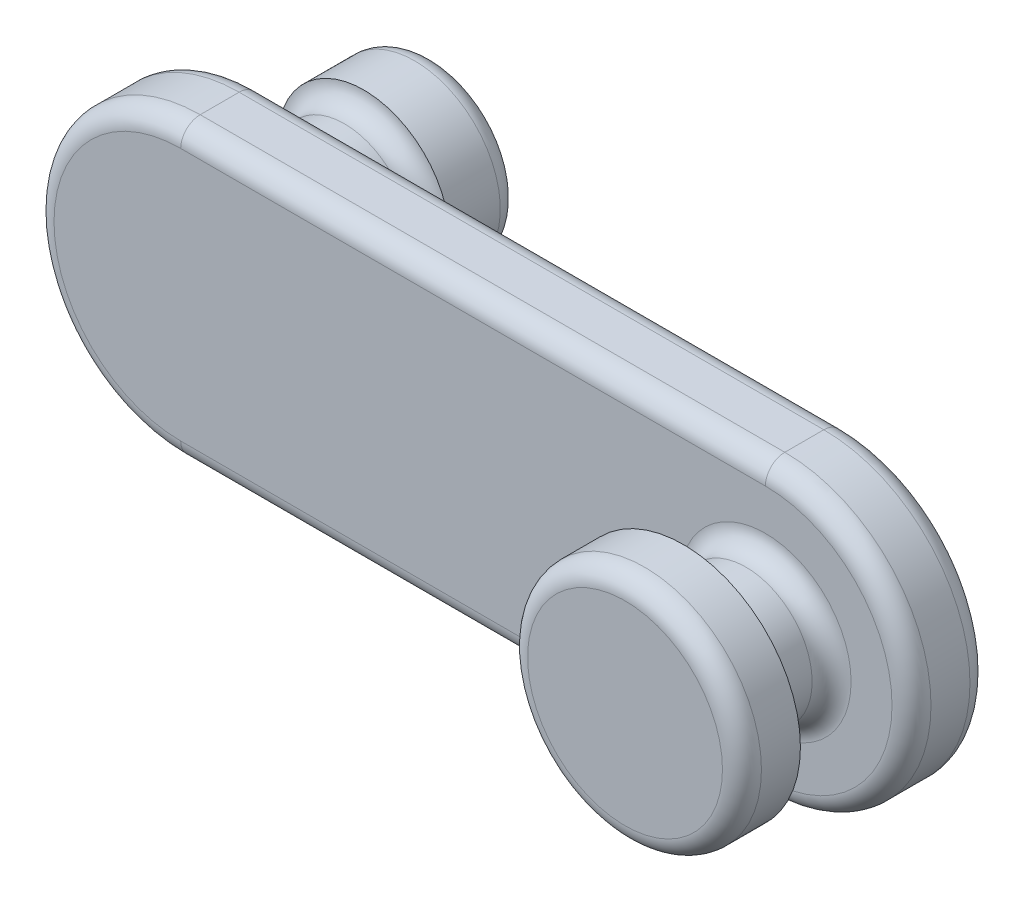
ISO-10303-21;
HEADER;
FILE_DESCRIPTION(('STEP AP214'),'2;1');
FILE_NAME('part.step','',(''),(''),'','','');
FILE_SCHEMA(('AUTOMOTIVE_DESIGN { 1 0 10303 214 1 1 1 1 }'));
ENDSEC;
DATA;
#1=APPLICATION_CONTEXT('core data for automotive mechanical design processes');
#2=APPLICATION_PROTOCOL_DEFINITION('international standard','automotive_design',2000,#1);
#3=PRODUCT_CONTEXT('',#1,'mechanical');
#4=PRODUCT('Part','Part','',(#3));
#5=PRODUCT_RELATED_PRODUCT_CATEGORY('part','',(#4));
#6=PRODUCT_DEFINITION_FORMATION('','',#4);
#7=PRODUCT_DEFINITION_CONTEXT('part definition',#1,'design');
#8=PRODUCT_DEFINITION('design','',#6,#7);
#9=PRODUCT_DEFINITION_SHAPE('','',#8);
#10=(LENGTH_UNIT() NAMED_UNIT(*) SI_UNIT(.MILLI.,.METRE.));
#11=(NAMED_UNIT(*) PLANE_ANGLE_UNIT() SI_UNIT($,.RADIAN.));
#12=(NAMED_UNIT(*) SI_UNIT($,.STERADIAN.) SOLID_ANGLE_UNIT());
#13=UNCERTAINTY_MEASURE_WITH_UNIT(LENGTH_MEASURE(1.E-05),#10,'distance_accuracy_value','');
#14=(GEOMETRIC_REPRESENTATION_CONTEXT(3) GLOBAL_UNCERTAINTY_ASSIGNED_CONTEXT((#13)) GLOBAL_UNIT_ASSIGNED_CONTEXT((#10,
#11,#12)) REPRESENTATION_CONTEXT('',''));
#15=CARTESIAN_POINT('',(0.,0.,0.));
#16=DIRECTION('',(0.,0.,1.));
#17=DIRECTION('',(1.,0.,0.));
#18=AXIS2_PLACEMENT_3D('',#15,#16,#17);
#19=CARTESIAN_POINT('',(-15.,0.,4.));
#20=DIRECTION('',(0.,0.,1.));
#21=DIRECTION('',(1.,0.,0.));
#22=AXIS2_PLACEMENT_3D('',#19,#20,#21);
#23=PLANE('',#22);
#24=CARTESIAN_POINT('',(15.,0.,4.));
#25=DIRECTION('',(0.,0.,1.));
#26=DIRECTION('',(1.,0.,0.));
#27=AXIS2_PLACEMENT_3D('',#24,#25,#26);
#28=CIRCLE('',#27,4.4);
#29=CARTESIAN_POINT('',(19.4,0.,4.));
#30=VERTEX_POINT('',#29);
#31=EDGE_CURVE('E126',#30,#30,#28,.F.);
#32=ORIENTED_EDGE('',*,*,#31,.T.);
#33=EDGE_LOOP('',(#32));
#34=FACE_BOUND('',#33,.T.);
#35=DIRECTION('',(1.,0.,0.));
#36=VECTOR('',#35,1.);
#37=CARTESIAN_POINT('',(15.,-6.5,4.));
#38=LINE('',#37,#36);
#39=CARTESIAN_POINT('',(-15.,-6.5,4.));
#40=VERTEX_POINT('',#39);
#41=CARTESIAN_POINT('',(15.,-6.5,4.));
#42=VERTEX_POINT('',#41);
#43=EDGE_CURVE('E124',#40,#42,#38,.T.);
#44=ORIENTED_EDGE('',*,*,#43,.T.);
#45=CARTESIAN_POINT('',(15.,0.,4.));
#46=DIRECTION('',(0.,0.,1.));
#47=DIRECTION('',(1.,0.,0.));
#48=AXIS2_PLACEMENT_3D('',#45,#46,#47);
#49=CIRCLE('',#48,6.5);
#50=CARTESIAN_POINT('',(15.,6.5,4.));
#51=VERTEX_POINT('',#50);
#52=EDGE_CURVE('E106',#42,#51,#49,.T.);
#53=ORIENTED_EDGE('',*,*,#52,.T.);
#54=DIRECTION('',(-1.,0.,0.));
#55=VECTOR('',#54,1.);
#56=CARTESIAN_POINT('',(-15.,6.5,4.));
#57=LINE('',#56,#55);
#58=CARTESIAN_POINT('',(-15.,6.5,4.));
#59=VERTEX_POINT('',#58);
#60=EDGE_CURVE('E114',#51,#59,#57,.T.);
#61=ORIENTED_EDGE('',*,*,#60,.T.);
#62=CARTESIAN_POINT('',(-15.,0.,4.));
#63=DIRECTION('',(0.,0.,1.));
#64=DIRECTION('',(1.,0.,0.));
#65=AXIS2_PLACEMENT_3D('',#62,#63,#64);
#66=CIRCLE('',#65,6.5);
#67=EDGE_CURVE('E120',#59,#40,#66,.T.);
#68=ORIENTED_EDGE('',*,*,#67,.T.);
#69=EDGE_LOOP('',(#44,#53,#61,#68));
#70=FACE_BOUND('',#69,.T.);
#71=ADVANCED_FACE('F32',(#34,#70),#23,.T.);
#72=CARTESIAN_POINT('',(-15.,0.,0.));
#73=DIRECTION('',(0.,0.,1.));
#74=DIRECTION('',(1.,0.,0.));
#75=AXIS2_PLACEMENT_3D('',#72,#73,#74);
#76=PLANE('',#75);
#77=DIRECTION('',(-1.,0.,0.));
#78=VECTOR('',#77,1.);
#79=CARTESIAN_POINT('',(-15.,6.5,0.));
#80=LINE('',#79,#78);
#81=CARTESIAN_POINT('',(-15.,6.5,0.));
#82=VERTEX_POINT('',#81);
#83=CARTESIAN_POINT('',(15.,6.5,0.));
#84=VERTEX_POINT('',#83);
#85=EDGE_CURVE('E148',#82,#84,#80,.F.);
#86=ORIENTED_EDGE('',*,*,#85,.T.);
#87=CARTESIAN_POINT('',(15.,0.,0.));
#88=DIRECTION('',(0.,0.,1.));
#89=DIRECTION('',(1.,0.,0.));
#90=AXIS2_PLACEMENT_3D('',#87,#88,#89);
#91=CIRCLE('',#90,6.5);
#92=CARTESIAN_POINT('',(15.,-6.5,0.));
#93=VERTEX_POINT('',#92);
#94=EDGE_CURVE('E153',#84,#93,#91,.F.);
#95=ORIENTED_EDGE('',*,*,#94,.T.);
#96=DIRECTION('',(1.,0.,0.));
#97=VECTOR('',#96,1.);
#98=CARTESIAN_POINT('',(-15.,-6.5,0.));
#99=LINE('',#98,#97);
#100=CARTESIAN_POINT('',(-15.,-6.5,0.));
#101=VERTEX_POINT('',#100);
#102=EDGE_CURVE('E56',#93,#101,#99,.F.);
#103=ORIENTED_EDGE('',*,*,#102,.T.);
#104=CARTESIAN_POINT('',(-15.,0.,0.));
#105=DIRECTION('',(0.,0.,1.));
#106=DIRECTION('',(1.,0.,0.));
#107=AXIS2_PLACEMENT_3D('',#104,#105,#106);
#108=CIRCLE('',#107,6.5);
#109=EDGE_CURVE('E150',#101,#82,#108,.F.);
#110=ORIENTED_EDGE('',*,*,#109,.T.);
#111=EDGE_LOOP('',(#86,#95,#103,#110));
#112=FACE_BOUND('',#111,.T.);
#113=CARTESIAN_POINT('',(-15.,0.,0.));
#114=DIRECTION('',(0.,0.,1.));
#115=DIRECTION('',(1.,0.,0.));
#116=AXIS2_PLACEMENT_3D('',#113,#114,#115);
#117=CIRCLE('',#116,4.4);
#118=CARTESIAN_POINT('',(-10.6,0.,0.));
#119=VERTEX_POINT('',#118);
#120=EDGE_CURVE('E145',#119,#119,#117,.T.);
#121=ORIENTED_EDGE('',*,*,#120,.T.);
#122=EDGE_LOOP('',(#121));
#123=FACE_BOUND('',#122,.T.);
#124=ADVANCED_FACE('F204',(#112,#123),#76,.F.);
#125=CARTESIAN_POINT('',(-15.,0.,4.));
#126=DIRECTION('',(0.,0.,-1.));
#127=DIRECTION('',(-1.,0.,0.));
#128=AXIS2_PLACEMENT_3D('',#125,#126,#127);
#129=CYLINDRICAL_SURFACE('',#128,7.5);
#130=DIRECTION('',(0.,0.,-1.));
#131=VECTOR('',#130,1.);
#132=CARTESIAN_POINT('',(-15.,-7.5,4.));
#133=LINE('',#132,#131);
#134=CARTESIAN_POINT('',(-15.,-7.5,3.));
#135=VERTEX_POINT('',#134);
#136=CARTESIAN_POINT('',(-15.,-7.5,1.));
#137=VERTEX_POINT('',#136);
#138=EDGE_CURVE('E121',#135,#137,#133,.T.);
#139=ORIENTED_EDGE('',*,*,#138,.F.);
#140=CARTESIAN_POINT('',(-15.,0.,3.));
#141=DIRECTION('',(0.,0.,1.));
#142=DIRECTION('',(1.,0.,0.));
#143=AXIS2_PLACEMENT_3D('',#140,#141,#142);
#144=CIRCLE('',#143,7.5);
#145=CARTESIAN_POINT('',(-15.,7.5,3.));
#146=VERTEX_POINT('',#145);
#147=EDGE_CURVE('E143',#135,#146,#144,.F.);
#148=ORIENTED_EDGE('',*,*,#147,.T.);
#149=DIRECTION('',(0.,0.,-1.));
#150=VECTOR('',#149,1.);
#151=CARTESIAN_POINT('',(-15.,7.5,4.));
#152=LINE('',#151,#150);
#153=CARTESIAN_POINT('',(-15.,7.5,1.));
#154=VERTEX_POINT('',#153);
#155=EDGE_CURVE('E221',#146,#154,#152,.T.);
#156=ORIENTED_EDGE('',*,*,#155,.T.);
#157=CARTESIAN_POINT('',(-15.,0.,1.));
#158=DIRECTION('',(0.,0.,1.));
#159=DIRECTION('',(1.,0.,0.));
#160=AXIS2_PLACEMENT_3D('',#157,#158,#159);
#161=CIRCLE('',#160,7.5);
#162=EDGE_CURVE('E141',#154,#137,#161,.T.);
#163=ORIENTED_EDGE('',*,*,#162,.T.);
#164=EDGE_LOOP('',(#139,#148,#156,#163));
#165=FACE_BOUND('',#164,.T.);
#166=ADVANCED_FACE('F240',(#165),#129,.T.);
#167=CARTESIAN_POINT('',(-15.,-7.5,4.));
#168=DIRECTION('',(0.,1.,0.));
#169=DIRECTION('',(0.,0.,1.));
#170=AXIS2_PLACEMENT_3D('',#167,#168,#169);
#171=PLANE('',#170);
#172=DIRECTION('',(0.,0.,-1.));
#173=VECTOR('',#172,1.);
#174=CARTESIAN_POINT('',(15.,-7.5,4.));
#175=LINE('',#174,#173);
#176=CARTESIAN_POINT('',(15.,-7.5,3.));
#177=VERTEX_POINT('',#176);
#178=CARTESIAN_POINT('',(15.,-7.5,1.));
#179=VERTEX_POINT('',#178);
#180=EDGE_CURVE('E219',#177,#179,#175,.T.);
#181=ORIENTED_EDGE('',*,*,#180,.F.);
#182=DIRECTION('',(1.,0.,0.));
#183=VECTOR('',#182,1.);
#184=CARTESIAN_POINT('',(-15.,-7.5,3.));
#185=LINE('',#184,#183);
#186=EDGE_CURVE('E139',#177,#135,#185,.F.);
#187=ORIENTED_EDGE('',*,*,#186,.T.);
#188=ORIENTED_EDGE('',*,*,#138,.T.);
#189=DIRECTION('',(1.,0.,0.));
#190=VECTOR('',#189,1.);
#191=CARTESIAN_POINT('',(-15.,-7.5,1.));
#192=LINE('',#191,#190);
#193=EDGE_CURVE('E137',#137,#179,#192,.T.);
#194=ORIENTED_EDGE('',*,*,#193,.T.);
#195=EDGE_LOOP('',(#181,#187,#188,#194));
#196=FACE_BOUND('',#195,.T.);
#197=ADVANCED_FACE('F238',(#196),#171,.F.);
#198=CARTESIAN_POINT('',(15.,0.,4.));
#199=DIRECTION('',(0.,0.,-1.));
#200=DIRECTION('',(-1.,0.,0.));
#201=AXIS2_PLACEMENT_3D('',#198,#199,#200);
#202=CYLINDRICAL_SURFACE('',#201,7.5);
#203=DIRECTION('',(0.,0.,-1.));
#204=VECTOR('',#203,1.);
#205=CARTESIAN_POINT('',(15.,7.5,4.));
#206=LINE('',#205,#204);
#207=CARTESIAN_POINT('',(15.,7.5,3.));
#208=VERTEX_POINT('',#207);
#209=CARTESIAN_POINT('',(15.,7.5,1.));
#210=VERTEX_POINT('',#209);
#211=EDGE_CURVE('E217',#208,#210,#206,.T.);
#212=ORIENTED_EDGE('',*,*,#211,.F.);
#213=CARTESIAN_POINT('',(15.,0.,3.));
#214=DIRECTION('',(0.,0.,1.));
#215=DIRECTION('',(1.,0.,0.));
#216=AXIS2_PLACEMENT_3D('',#213,#214,#215);
#217=CIRCLE('',#216,7.5);
#218=EDGE_CURVE('E108',#208,#177,#217,.F.);
#219=ORIENTED_EDGE('',*,*,#218,.T.);
#220=ORIENTED_EDGE('',*,*,#180,.T.);
#221=CARTESIAN_POINT('',(15.,0.,1.));
#222=DIRECTION('',(0.,0.,1.));
#223=DIRECTION('',(1.,0.,0.));
#224=AXIS2_PLACEMENT_3D('',#221,#222,#223);
#225=CIRCLE('',#224,7.5);
#226=EDGE_CURVE('E129',#179,#210,#225,.T.);
#227=ORIENTED_EDGE('',*,*,#226,.T.);
#228=EDGE_LOOP('',(#212,#219,#220,#227));
#229=FACE_BOUND('',#228,.T.);
#230=ADVANCED_FACE('F216',(#229),#202,.T.);
#231=CARTESIAN_POINT('',(-15.,7.5,4.));
#232=DIRECTION('',(0.,-1.,0.));
#233=DIRECTION('',(0.,0.,-1.));
#234=AXIS2_PLACEMENT_3D('',#231,#232,#233);
#235=PLANE('',#234);
#236=ORIENTED_EDGE('',*,*,#155,.F.);
#237=DIRECTION('',(-1.,0.,0.));
#238=VECTOR('',#237,1.);
#239=CARTESIAN_POINT('',(15.,7.5,3.));
#240=LINE('',#239,#238);
#241=EDGE_CURVE('E175',#146,#208,#240,.F.);
#242=ORIENTED_EDGE('',*,*,#241,.T.);
#243=ORIENTED_EDGE('',*,*,#211,.T.);
#244=DIRECTION('',(-1.,0.,0.));
#245=VECTOR('',#244,1.);
#246=CARTESIAN_POINT('',(-15.,7.5,1.));
#247=LINE('',#246,#245);
#248=EDGE_CURVE('E173',#210,#154,#247,.T.);
#249=ORIENTED_EDGE('',*,*,#248,.T.);
#250=EDGE_LOOP('',(#236,#242,#243,#249));
#251=FACE_BOUND('',#250,.T.);
#252=ADVANCED_FACE('F220',(#251),#235,.F.);
#253=CARTESIAN_POINT('',(-15.,0.,-5.4));
#254=DIRECTION('',(0.,0.,1.));
#255=DIRECTION('',(1.,0.,0.));
#256=AXIS2_PLACEMENT_3D('',#253,#254,#255);
#257=CYLINDRICAL_SURFACE('',#256,3.4);
#258=CARTESIAN_POINT('',(-15.,0.,-1.));
#259=DIRECTION('',(0.,0.,1.));
#260=DIRECTION('',(1.,0.,0.));
#261=AXIS2_PLACEMENT_3D('',#258,#259,#260);
#262=CIRCLE('',#261,3.4);
#263=CARTESIAN_POINT('',(-11.6,0.,-1.));
#264=VERTEX_POINT('',#263);
#265=EDGE_CURVE('E41',#264,#264,#262,.F.);
#266=CARTESIAN_POINT('',(-15.,0.,-4.4));
#267=DIRECTION('',(0.,0.,-1.));
#268=DIRECTION('',(-1.,0.,0.));
#269=AXIS2_PLACEMENT_3D('',#266,#267,#268);
#270=CIRCLE('',#269,3.4);
#271=CARTESIAN_POINT('',(-11.6,0.,-4.4));
#272=VERTEX_POINT('',#271);
#273=EDGE_CURVE('E177',#272,#272,#270,.F.);
#274=CARTESIAN_POINT('',(-11.6,0.,-1.));
#275=CARTESIAN_POINT('',(-11.6,0.,-1.03541666666667));
#276=CARTESIAN_POINT('',(-11.6,0.,-1.07083333333333));
#277=CARTESIAN_POINT('',(-11.6,0.,-1.14166666666667));
#278=CARTESIAN_POINT('',(-11.6,0.,-1.17708333333333));
#279=CARTESIAN_POINT('',(-11.6,0.,-1.24791666666667));
#280=CARTESIAN_POINT('',(-11.6,0.,-1.28333333333333));
#281=CARTESIAN_POINT('',(-11.6,0.,-1.35416666666667));
#282=CARTESIAN_POINT('',(-11.6,0.,-1.38958333333333));
#283=CARTESIAN_POINT('',(-11.6,0.,-1.46041666666667));
#284=CARTESIAN_POINT('',(-11.6,0.,-1.49583333333333));
#285=CARTESIAN_POINT('',(-11.6,0.,-1.56666666666667));
#286=CARTESIAN_POINT('',(-11.6,0.,-1.60208333333333));
#287=CARTESIAN_POINT('',(-11.6,0.,-1.67291666666667));
#288=CARTESIAN_POINT('',(-11.6,0.,-1.70833333333333));
#289=CARTESIAN_POINT('',(-11.6,0.,-1.77916666666667));
#290=CARTESIAN_POINT('',(-11.6,0.,-1.81458333333333));
#291=CARTESIAN_POINT('',(-11.6,0.,-1.88541666666667));
#292=CARTESIAN_POINT('',(-11.6,0.,-1.92083333333333));
#293=CARTESIAN_POINT('',(-11.6,0.,-1.99166666666667));
#294=CARTESIAN_POINT('',(-11.6,0.,-2.02708333333333));
#295=CARTESIAN_POINT('',(-11.6,0.,-2.09791666666667));
#296=CARTESIAN_POINT('',(-11.6,0.,-2.13333333333333));
#297=CARTESIAN_POINT('',(-11.6,0.,-2.20416666666667));
#298=CARTESIAN_POINT('',(-11.6,0.,-2.23958333333333));
#299=CARTESIAN_POINT('',(-11.6,0.,-2.31041666666667));
#300=CARTESIAN_POINT('',(-11.6,0.,-2.34583333333333));
#301=CARTESIAN_POINT('',(-11.6,0.,-2.41666666666667));
#302=CARTESIAN_POINT('',(-11.6,0.,-2.45208333333333));
#303=CARTESIAN_POINT('',(-11.6,0.,-2.52291666666667));
#304=CARTESIAN_POINT('',(-11.6,0.,-2.55833333333333));
#305=CARTESIAN_POINT('',(-11.6,0.,-2.62916666666667));
#306=CARTESIAN_POINT('',(-11.6,0.,-2.66458333333333));
#307=CARTESIAN_POINT('',(-11.6,0.,-2.73541666666667));
#308=CARTESIAN_POINT('',(-11.6,0.,-2.77083333333333));
#309=CARTESIAN_POINT('',(-11.6,0.,-2.84166666666667));
#310=CARTESIAN_POINT('',(-11.6,0.,-2.87708333333333));
#311=CARTESIAN_POINT('',(-11.6,0.,-2.94791666666667));
#312=CARTESIAN_POINT('',(-11.6,0.,-2.98333333333333));
#313=CARTESIAN_POINT('',(-11.6,0.,-3.05416666666667));
#314=CARTESIAN_POINT('',(-11.6,0.,-3.08958333333333));
#315=CARTESIAN_POINT('',(-11.6,0.,-3.16041666666667));
#316=CARTESIAN_POINT('',(-11.6,0.,-3.19583333333333));
#317=CARTESIAN_POINT('',(-11.6,0.,-3.26666666666667));
#318=CARTESIAN_POINT('',(-11.6,0.,-3.30208333333333));
#319=CARTESIAN_POINT('',(-11.6,0.,-3.37291666666667));
#320=CARTESIAN_POINT('',(-11.6,0.,-3.40833333333333));
#321=CARTESIAN_POINT('',(-11.6,0.,-3.47916666666667));
#322=CARTESIAN_POINT('',(-11.6,0.,-3.51458333333333));
#323=CARTESIAN_POINT('',(-11.6,0.,-3.58541666666667));
#324=CARTESIAN_POINT('',(-11.6,0.,-3.62083333333333));
#325=CARTESIAN_POINT('',(-11.6,0.,-3.69166666666667));
#326=CARTESIAN_POINT('',(-11.6,0.,-3.72708333333333));
#327=CARTESIAN_POINT('',(-11.6,0.,-3.79791666666667));
#328=CARTESIAN_POINT('',(-11.6,0.,-3.83333333333333));
#329=CARTESIAN_POINT('',(-11.6,0.,-3.90416666666667));
#330=CARTESIAN_POINT('',(-11.6,0.,-3.93958333333333));
#331=CARTESIAN_POINT('',(-11.6,0.,-4.01041666666667));
#332=CARTESIAN_POINT('',(-11.6,0.,-4.04583333333333));
#333=CARTESIAN_POINT('',(-11.6,0.,-4.11666666666667));
#334=CARTESIAN_POINT('',(-11.6,0.,-4.15208333333333));
#335=CARTESIAN_POINT('',(-11.6,0.,-4.22291666666667));
#336=CARTESIAN_POINT('',(-11.6,0.,-4.25833333333333));
#337=CARTESIAN_POINT('',(-11.6,0.,-4.32916666666667));
#338=CARTESIAN_POINT('',(-11.6,0.,-4.36458333333333));
#339=CARTESIAN_POINT('',(-11.6,0.,-4.4));
#340=B_SPLINE_CURVE_WITH_KNOTS('',3,(#274,#275,#276,#277,#278,#279,#280,#281,#282,#283,#284,
#285,#286,#287,#288,#289,#290,#291,#292,#293,#294,#295,#296,#297,#298,#299,#300,#301,#302,#303,
#304,#305,#306,#307,#308,#309,#310,#311,#312,#313,#314,#315,#316,#317,#318,#319,#320,#321,#322,
#323,#324,#325,#326,#327,#328,#329,#330,#331,#332,#333,#334,#335,#336,#337,#338,#339),
.UNSPECIFIED.,.F.,.F.,(4,2,2,2,2,2,2,2,2,2,2,2,2,2,2,2,2,2,2,2,2,2,2,2,2,2,2,2,2,2,2,2,4),(0.,
0.10625,0.2125,0.31875,0.425,0.531249999999999,0.6375,0.743749999999999,0.849999999999999,
0.956249999999999,1.0625,1.16875,1.275,1.38125,1.4875,1.59375,1.7,1.80625,1.9125,2.01875,2.125,
2.23125,2.3375,2.44375,2.55,2.65625,2.7625,2.86875,2.975,3.08125,3.1875,3.29375,3.4),.UNSPECIFIED.);
#341=EDGE_CURVE('BSEAM256',#264,#272,#340,.T.);
#342=ORIENTED_EDGE('',*,*,#265,.T.);
#343=ORIENTED_EDGE('',*,*,#273,.T.);
#344=ORIENTED_EDGE('',*,*,#341,.T.);
#345=ORIENTED_EDGE('',*,*,#341,.F.);
#346=EDGE_LOOP('',(#342,#344,#343,#345));
#347=FACE_BOUND('',#346,.T.);
#348=ADVANCED_FACE('F256',(#347),#257,.T.);
#349=CARTESIAN_POINT('',(-15.,0.,-9.));
#350=DIRECTION('',(0.,0.,1.));
#351=DIRECTION('',(1.,0.,0.));
#352=AXIS2_PLACEMENT_3D('',#349,#350,#351);
#353=CYLINDRICAL_SURFACE('',#352,4.4);
#354=CARTESIAN_POINT('',(-15.,0.,-8.));
#355=DIRECTION('',(0.,0.,-1.));
#356=DIRECTION('',(-1.,0.,0.));
#357=AXIS2_PLACEMENT_3D('',#354,#355,#356);
#358=CIRCLE('',#357,4.4);
#359=CARTESIAN_POINT('',(-19.4,0.,-8.));
#360=VERTEX_POINT('',#359);
#361=EDGE_CURVE('E170',#360,#360,#358,.F.);
#362=ORIENTED_EDGE('',*,*,#361,.T.);
#363=EDGE_LOOP('',(#362));
#364=FACE_BOUND('',#363,.T.);
#365=CARTESIAN_POINT('',(-15.,0.,-5.4));
#366=DIRECTION('',(0.,0.,-1.));
#367=DIRECTION('',(-1.,0.,0.));
#368=AXIS2_PLACEMENT_3D('',#365,#366,#367);
#369=CIRCLE('',#368,4.4);
#370=CARTESIAN_POINT('',(-19.4,0.,-5.4));
#371=VERTEX_POINT('',#370);
#372=EDGE_CURVE('E224',#371,#371,#369,.T.);
#373=ORIENTED_EDGE('',*,*,#372,.T.);
#374=EDGE_LOOP('',(#373));
#375=FACE_BOUND('',#374,.T.);
#376=ADVANCED_FACE('F276',(#364,#375),#353,.T.);
#377=CARTESIAN_POINT('',(-15.,0.,-9.));
#378=DIRECTION('',(0.,0.,-1.));
#379=DIRECTION('',(-1.,0.,0.));
#380=AXIS2_PLACEMENT_3D('',#377,#378,#379);
#381=PLANE('',#380);
#382=CARTESIAN_POINT('',(-15.,0.,-9.));
#383=DIRECTION('',(0.,0.,-1.));
#384=DIRECTION('',(-1.,0.,0.));
#385=AXIS2_PLACEMENT_3D('',#382,#383,#384);
#386=CIRCLE('',#385,3.4);
#387=CARTESIAN_POINT('',(-18.4,0.,-9.));
#388=VERTEX_POINT('',#387);
#389=EDGE_CURVE('E167',#388,#388,#386,.T.);
#390=ORIENTED_EDGE('',*,*,#389,.T.);
#391=EDGE_LOOP('',(#390));
#392=FACE_BOUND('',#391,.T.);
#393=ADVANCED_FACE('F283',(#392),#381,.T.);
#394=CARTESIAN_POINT('',(15.,0.,8.2));
#395=DIRECTION('',(0.,0.,-1.));
#396=DIRECTION('',(-1.,0.,0.));
#397=AXIS2_PLACEMENT_3D('',#394,#395,#396);
#398=CYLINDRICAL_SURFACE('',#397,3.4);
#399=CARTESIAN_POINT('',(15.,0.,5.));
#400=DIRECTION('',(0.,0.,1.));
#401=DIRECTION('',(1.,0.,0.));
#402=AXIS2_PLACEMENT_3D('',#399,#400,#401);
#403=CIRCLE('',#402,3.4);
#404=CARTESIAN_POINT('',(18.4,0.,5.));
#405=VERTEX_POINT('',#404);
#406=EDGE_CURVE('E164',#405,#405,#403,.T.);
#407=ORIENTED_EDGE('',*,*,#406,.T.);
#408=EDGE_LOOP('',(#407));
#409=FACE_BOUND('',#408,.T.);
#410=CARTESIAN_POINT('',(15.,0.,7.2));
#411=DIRECTION('',(0.,0.,1.));
#412=DIRECTION('',(1.,0.,0.));
#413=AXIS2_PLACEMENT_3D('',#410,#411,#412);
#414=CIRCLE('',#413,3.4);
#415=CARTESIAN_POINT('',(18.4,0.,7.2));
#416=VERTEX_POINT('',#415);
#417=EDGE_CURVE('E161',#416,#416,#414,.F.);
#418=ORIENTED_EDGE('',*,*,#417,.T.);
#419=EDGE_LOOP('',(#418));
#420=FACE_BOUND('',#419,.T.);
#421=ADVANCED_FACE('F290',(#409,#420),#398,.T.);
#422=CARTESIAN_POINT('',(15.,0.,8.2));
#423=DIRECTION('',(0.,0.,1.));
#424=DIRECTION('',(1.,0.,0.));
#425=AXIS2_PLACEMENT_3D('',#422,#423,#424);
#426=PLANE('',#425);
#427=CARTESIAN_POINT('',(15.,0.,8.2));
#428=DIRECTION('',(0.,0.,1.));
#429=DIRECTION('',(1.,0.,0.));
#430=AXIS2_PLACEMENT_3D('',#427,#428,#429);
#431=CIRCLE('',#430,4.4);
#432=CARTESIAN_POINT('',(19.4,0.,8.2));
#433=VERTEX_POINT('',#432);
#434=EDGE_CURVE('E11',#433,#433,#431,.T.);
#435=ORIENTED_EDGE('',*,*,#434,.T.);
#436=EDGE_LOOP('',(#435));
#437=FACE_BOUND('',#436,.T.);
#438=CARTESIAN_POINT('',(15.,0.,8.2));
#439=DIRECTION('',(0.,0.,1.));
#440=DIRECTION('',(1.,0.,0.));
#441=AXIS2_PLACEMENT_3D('',#438,#439,#440);
#442=CIRCLE('',#441,6.);
#443=CARTESIAN_POINT('',(21.,0.,8.2));
#444=VERTEX_POINT('',#443);
#445=EDGE_CURVE('E187',#444,#444,#442,.T.);
#446=ORIENTED_EDGE('',*,*,#445,.F.);
#447=EDGE_LOOP('',(#446));
#448=FACE_BOUND('',#447,.T.);
#449=ADVANCED_FACE('F298',(#437,#448),#426,.F.);
#450=CARTESIAN_POINT('',(15.,0.,11.2));
#451=DIRECTION('',(0.,0.,-1.));
#452=DIRECTION('',(-1.,0.,0.));
#453=AXIS2_PLACEMENT_3D('',#450,#451,#452);
#454=CYLINDRICAL_SURFACE('',#453,6.);
#455=CARTESIAN_POINT('',(15.,0.,10.2));
#456=DIRECTION('',(0.,0.,1.));
#457=DIRECTION('',(1.,0.,0.));
#458=AXIS2_PLACEMENT_3D('',#455,#456,#457);
#459=CIRCLE('',#458,6.);
#460=CARTESIAN_POINT('',(21.,0.,10.2));
#461=VERTEX_POINT('',#460);
#462=EDGE_CURVE('E158',#461,#461,#459,.F.);
#463=ORIENTED_EDGE('',*,*,#462,.T.);
#464=EDGE_LOOP('',(#463));
#465=FACE_BOUND('',#464,.T.);
#466=ORIENTED_EDGE('',*,*,#445,.T.);
#467=EDGE_LOOP('',(#466));
#468=FACE_BOUND('',#467,.T.);
#469=ADVANCED_FACE('F306',(#465,#468),#454,.T.);
#470=CARTESIAN_POINT('',(15.,0.,11.2));
#471=DIRECTION('',(0.,0.,1.));
#472=DIRECTION('',(1.,0.,0.));
#473=AXIS2_PLACEMENT_3D('',#470,#471,#472);
#474=PLANE('',#473);
#475=CARTESIAN_POINT('',(15.,0.,11.2));
#476=DIRECTION('',(0.,0.,1.));
#477=DIRECTION('',(1.,0.,0.));
#478=AXIS2_PLACEMENT_3D('',#475,#476,#477);
#479=CIRCLE('',#478,5.);
#480=CARTESIAN_POINT('',(20.,0.,11.2));
#481=VERTEX_POINT('',#480);
#482=EDGE_CURVE('E155',#481,#481,#479,.T.);
#483=ORIENTED_EDGE('',*,*,#482,.T.);
#484=EDGE_LOOP('',(#483));
#485=FACE_BOUND('',#484,.T.);
#486=ADVANCED_FACE('F314',(#485),#474,.T.);
#487=CARTESIAN_POINT('',(-15.,0.,3.));
#488=DIRECTION('',(0.,0.,1.));
#489=DIRECTION('',(1.,0.,0.));
#490=AXIS2_PLACEMENT_3D('',#487,#488,#489);
#491=TOROIDAL_SURFACE('',#490,6.5,1.);
#492=CARTESIAN_POINT('',(-15.,6.5,3.));
#493=DIRECTION('',(1.,0.,0.));
#494=DIRECTION('',(0.,0.,-1.));
#495=AXIS2_PLACEMENT_3D('',#492,#493,#494);
#496=CIRCLE('',#495,1.);
#497=EDGE_CURVE('E117',#146,#59,#496,.T.);
#498=ORIENTED_EDGE('',*,*,#497,.F.);
#499=ORIENTED_EDGE('',*,*,#147,.F.);
#500=CARTESIAN_POINT('',(-15.,-6.5,3.));
#501=DIRECTION('',(1.,0.,0.));
#502=DIRECTION('',(0.,0.,-1.));
#503=AXIS2_PLACEMENT_3D('',#500,#501,#502);
#504=CIRCLE('',#503,1.);
#505=EDGE_CURVE('E184',#40,#135,#504,.T.);
#506=ORIENTED_EDGE('',*,*,#505,.F.);
#507=ORIENTED_EDGE('',*,*,#67,.F.);
#508=EDGE_LOOP('',(#498,#499,#506,#507));
#509=FACE_BOUND('',#508,.T.);
#510=ADVANCED_FACE('F232',(#509),#491,.T.);
#511=CARTESIAN_POINT('',(-15.,-6.5,3.));
#512=DIRECTION('',(-1.,0.,0.));
#513=DIRECTION('',(0.,0.,1.));
#514=AXIS2_PLACEMENT_3D('',#511,#512,#513);
#515=CYLINDRICAL_SURFACE('',#514,1.);
#516=ORIENTED_EDGE('',*,*,#505,.T.);
#517=ORIENTED_EDGE('',*,*,#186,.F.);
#518=CARTESIAN_POINT('',(15.,-6.5,3.));
#519=DIRECTION('',(1.,0.,0.));
#520=DIRECTION('',(0.,0.,-1.));
#521=AXIS2_PLACEMENT_3D('',#518,#519,#520);
#522=CIRCLE('',#521,1.);
#523=EDGE_CURVE('E111',#42,#177,#522,.T.);
#524=ORIENTED_EDGE('',*,*,#523,.F.);
#525=ORIENTED_EDGE('',*,*,#43,.F.);
#526=EDGE_LOOP('',(#516,#517,#524,#525));
#527=FACE_BOUND('',#526,.T.);
#528=ADVANCED_FACE('F235',(#527),#515,.T.);
#529=CARTESIAN_POINT('',(-15.,6.5,3.));
#530=DIRECTION('',(1.,0.,0.));
#531=DIRECTION('',(0.,0.,-1.));
#532=AXIS2_PLACEMENT_3D('',#529,#530,#531);
#533=CYLINDRICAL_SURFACE('',#532,1.);
#534=ORIENTED_EDGE('',*,*,#497,.T.);
#535=ORIENTED_EDGE('',*,*,#60,.F.);
#536=CARTESIAN_POINT('',(15.,6.5,3.));
#537=DIRECTION('',(1.,0.,0.));
#538=DIRECTION('',(0.,0.,-1.));
#539=AXIS2_PLACEMENT_3D('',#536,#537,#538);
#540=CIRCLE('',#539,1.);
#541=EDGE_CURVE('E102',#208,#51,#540,.T.);
#542=ORIENTED_EDGE('',*,*,#541,.F.);
#543=ORIENTED_EDGE('',*,*,#241,.F.);
#544=EDGE_LOOP('',(#534,#535,#542,#543));
#545=FACE_BOUND('',#544,.T.);
#546=ADVANCED_FACE('F115',(#545),#533,.T.);
#547=CARTESIAN_POINT('',(15.,0.,3.));
#548=DIRECTION('',(0.,0.,1.));
#549=DIRECTION('',(1.,0.,0.));
#550=AXIS2_PLACEMENT_3D('',#547,#548,#549);
#551=TOROIDAL_SURFACE('',#550,6.5,1.);
#552=ORIENTED_EDGE('',*,*,#523,.T.);
#553=ORIENTED_EDGE('',*,*,#218,.F.);
#554=ORIENTED_EDGE('',*,*,#541,.T.);
#555=ORIENTED_EDGE('',*,*,#52,.F.);
#556=EDGE_LOOP('',(#552,#553,#554,#555));
#557=FACE_BOUND('',#556,.T.);
#558=ADVANCED_FACE('F104',(#557),#551,.T.);
#559=CARTESIAN_POINT('',(-15.,0.,1.));
#560=DIRECTION('',(0.,0.,1.));
#561=DIRECTION('',(1.,0.,0.));
#562=AXIS2_PLACEMENT_3D('',#559,#560,#561);
#563=TOROIDAL_SURFACE('',#562,6.5,1.);
#564=CARTESIAN_POINT('',(-15.,6.5,1.));
#565=DIRECTION('',(1.,0.,0.));
#566=DIRECTION('',(0.,0.,-1.));
#567=AXIS2_PLACEMENT_3D('',#564,#565,#566);
#568=CIRCLE('',#567,1.);
#569=EDGE_CURVE('E190',#82,#154,#568,.T.);
#570=ORIENTED_EDGE('',*,*,#569,.F.);
#571=ORIENTED_EDGE('',*,*,#109,.F.);
#572=CARTESIAN_POINT('',(-15.,-6.5,1.));
#573=DIRECTION('',(1.,0.,0.));
#574=DIRECTION('',(0.,0.,-1.));
#575=AXIS2_PLACEMENT_3D('',#572,#573,#574);
#576=CIRCLE('',#575,1.);
#577=EDGE_CURVE('E36',#137,#101,#576,.T.);
#578=ORIENTED_EDGE('',*,*,#577,.F.);
#579=ORIENTED_EDGE('',*,*,#162,.F.);
#580=EDGE_LOOP('',(#570,#571,#578,#579));
#581=FACE_BOUND('',#580,.T.);
#582=ADVANCED_FACE('F203',(#581),#563,.T.);
#583=CARTESIAN_POINT('',(-15.,-6.5,1.));
#584=DIRECTION('',(1.,0.,0.));
#585=DIRECTION('',(0.,0.,-1.));
#586=AXIS2_PLACEMENT_3D('',#583,#584,#585);
#587=CYLINDRICAL_SURFACE('',#586,1.);
#588=ORIENTED_EDGE('',*,*,#577,.T.);
#589=ORIENTED_EDGE('',*,*,#102,.F.);
#590=CARTESIAN_POINT('',(15.,-6.5,1.));
#591=DIRECTION('',(1.,0.,0.));
#592=DIRECTION('',(0.,0.,-1.));
#593=AXIS2_PLACEMENT_3D('',#590,#591,#592);
#594=CIRCLE('',#593,1.);
#595=EDGE_CURVE('E49',#179,#93,#594,.T.);
#596=ORIENTED_EDGE('',*,*,#595,.F.);
#597=ORIENTED_EDGE('',*,*,#193,.F.);
#598=EDGE_LOOP('',(#588,#589,#596,#597));
#599=FACE_BOUND('',#598,.T.);
#600=ADVANCED_FACE('F200',(#599),#587,.T.);
#601=CARTESIAN_POINT('',(-15.,6.5,1.));
#602=DIRECTION('',(-1.,0.,0.));
#603=DIRECTION('',(0.,0.,1.));
#604=AXIS2_PLACEMENT_3D('',#601,#602,#603);
#605=CYLINDRICAL_SURFACE('',#604,1.);
#606=ORIENTED_EDGE('',*,*,#569,.T.);
#607=ORIENTED_EDGE('',*,*,#248,.F.);
#608=CARTESIAN_POINT('',(15.,6.5,1.));
#609=DIRECTION('',(1.,0.,0.));
#610=DIRECTION('',(0.,0.,-1.));
#611=AXIS2_PLACEMENT_3D('',#608,#609,#610);
#612=CIRCLE('',#611,1.);
#613=EDGE_CURVE('E188',#84,#210,#612,.T.);
#614=ORIENTED_EDGE('',*,*,#613,.F.);
#615=ORIENTED_EDGE('',*,*,#85,.F.);
#616=EDGE_LOOP('',(#606,#607,#614,#615));
#617=FACE_BOUND('',#616,.T.);
#618=ADVANCED_FACE('F208',(#617),#605,.T.);
#619=CARTESIAN_POINT('',(15.,0.,1.));
#620=DIRECTION('',(0.,0.,1.));
#621=DIRECTION('',(1.,0.,0.));
#622=AXIS2_PLACEMENT_3D('',#619,#620,#621);
#623=TOROIDAL_SURFACE('',#622,6.5,1.);
#624=ORIENTED_EDGE('',*,*,#595,.T.);
#625=ORIENTED_EDGE('',*,*,#94,.F.);
#626=ORIENTED_EDGE('',*,*,#613,.T.);
#627=ORIENTED_EDGE('',*,*,#226,.F.);
#628=EDGE_LOOP('',(#624,#625,#626,#627));
#629=FACE_BOUND('',#628,.T.);
#630=ADVANCED_FACE('F207',(#629),#623,.T.);
#631=CARTESIAN_POINT('',(15.,0.,10.2));
#632=DIRECTION('',(0.,0.,1.));
#633=DIRECTION('',(1.,0.,0.));
#634=AXIS2_PLACEMENT_3D('',#631,#632,#633);
#635=TOROIDAL_SURFACE('',#634,5.,1.);
#636=ORIENTED_EDGE('',*,*,#462,.F.);
#637=EDGE_LOOP('',(#636));
#638=FACE_BOUND('',#637,.T.);
#639=ORIENTED_EDGE('',*,*,#482,.F.);
#640=EDGE_LOOP('',(#639));
#641=FACE_BOUND('',#640,.T.);
#642=ADVANCED_FACE('F370',(#638,#641),#635,.T.);
#643=CARTESIAN_POINT('',(15.,0.,5.));
#644=DIRECTION('',(0.,0.,1.));
#645=DIRECTION('',(1.,0.,0.));
#646=AXIS2_PLACEMENT_3D('',#643,#644,#645);
#647=TOROIDAL_SURFACE('',#646,4.4,1.);
#648=ORIENTED_EDGE('',*,*,#31,.F.);
#649=EDGE_LOOP('',(#648));
#650=FACE_BOUND('',#649,.T.);
#651=ORIENTED_EDGE('',*,*,#406,.F.);
#652=EDGE_LOOP('',(#651));
#653=FACE_BOUND('',#652,.T.);
#654=ADVANCED_FACE('F377',(#650,#653),#647,.F.);
#655=CARTESIAN_POINT('',(-15.,0.,-8.));
#656=DIRECTION('',(0.,0.,-1.));
#657=DIRECTION('',(-1.,0.,0.));
#658=AXIS2_PLACEMENT_3D('',#655,#656,#657);
#659=TOROIDAL_SURFACE('',#658,3.4,1.);
#660=ORIENTED_EDGE('',*,*,#361,.F.);
#661=EDGE_LOOP('',(#660));
#662=FACE_BOUND('',#661,.T.);
#663=ORIENTED_EDGE('',*,*,#389,.F.);
#664=EDGE_LOOP('',(#663));
#665=FACE_BOUND('',#664,.T.);
#666=ADVANCED_FACE('F385',(#662,#665),#659,.T.);
#667=CARTESIAN_POINT('',(-15.,0.,-1.));
#668=DIRECTION('',(0.,0.,1.));
#669=DIRECTION('',(1.,0.,0.));
#670=AXIS2_PLACEMENT_3D('',#667,#668,#669);
#671=TOROIDAL_SURFACE('',#670,4.4,1.);
#672=ORIENTED_EDGE('',*,*,#120,.F.);
#673=EDGE_LOOP('',(#672));
#674=FACE_BOUND('',#673,.T.);
#675=ORIENTED_EDGE('',*,*,#265,.F.);
#676=EDGE_LOOP('',(#675));
#677=FACE_BOUND('',#676,.T.);
#678=ADVANCED_FACE('F393',(#674,#677),#671,.F.);
#679=CARTESIAN_POINT('',(-15.,0.,-4.4));
#680=DIRECTION('',(0.,0.,-1.));
#681=DIRECTION('',(-1.,0.,0.));
#682=AXIS2_PLACEMENT_3D('',#679,#680,#681);
#683=TOROIDAL_SURFACE('',#682,4.4,1.);
#684=ORIENTED_EDGE('',*,*,#273,.F.);
#685=EDGE_LOOP('',(#684));
#686=FACE_BOUND('',#685,.T.);
#687=ORIENTED_EDGE('',*,*,#372,.F.);
#688=EDGE_LOOP('',(#687));
#689=FACE_BOUND('',#688,.T.);
#690=ADVANCED_FACE('F401',(#686,#689),#683,.F.);
#691=CARTESIAN_POINT('',(15.,0.,7.2));
#692=DIRECTION('',(0.,0.,1.));
#693=DIRECTION('',(1.,0.,0.));
#694=AXIS2_PLACEMENT_3D('',#691,#692,#693);
#695=TOROIDAL_SURFACE('',#694,4.4,1.);
#696=ORIENTED_EDGE('',*,*,#417,.F.);
#697=EDGE_LOOP('',(#696));
#698=FACE_BOUND('',#697,.T.);
#699=ORIENTED_EDGE('',*,*,#434,.F.);
#700=EDGE_LOOP('',(#699));
#701=FACE_BOUND('',#700,.T.);
#702=ADVANCED_FACE('F34',(#698,#701),#695,.F.);
#703=CLOSED_SHELL('',(#71,#124,#166,#197,#230,#252,#348,#376,#393,#421,#449,#469,#486,#510,#528,
#546,#558,#582,#600,#618,#630,#642,#654,#666,#678,#690,#702));
#704=MANIFOLD_SOLID_BREP('B2',#703);
#705=ADVANCED_BREP_SHAPE_REPRESENTATION('',(#18,#704),#14);
#706=SHAPE_DEFINITION_REPRESENTATION(#9,#705);
ENDSEC;
END-ISO-10303-21;
